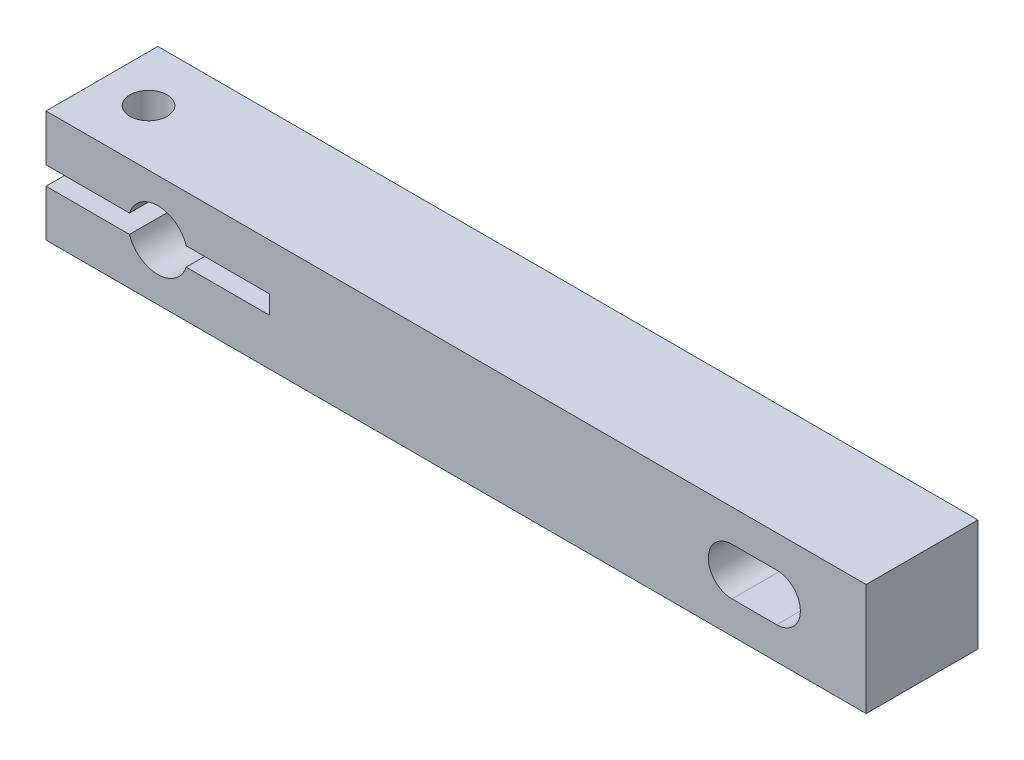
ISO-10303-21;
HEADER;
FILE_DESCRIPTION(('STEP AP214'),'2;1');
FILE_NAME('part.step','',(''),(''),'','','');
FILE_SCHEMA(('AUTOMOTIVE_DESIGN { 1 0 10303 214 1 1 1 1 }'));
ENDSEC;
DATA;
#1=APPLICATION_CONTEXT('core data for automotive mechanical design processes');
#2=APPLICATION_PROTOCOL_DEFINITION('international standard','automotive_design',2000,#1);
#3=PRODUCT_CONTEXT('',#1,'mechanical');
#4=PRODUCT('Part','Part','',(#3));
#5=PRODUCT_RELATED_PRODUCT_CATEGORY('part','',(#4));
#6=PRODUCT_DEFINITION_FORMATION('','',#4);
#7=PRODUCT_DEFINITION_CONTEXT('part definition',#1,'design');
#8=PRODUCT_DEFINITION('design','',#6,#7);
#9=PRODUCT_DEFINITION_SHAPE('','',#8);
#10=(LENGTH_UNIT() NAMED_UNIT(*) SI_UNIT(.MILLI.,.METRE.));
#11=(NAMED_UNIT(*) PLANE_ANGLE_UNIT() SI_UNIT($,.RADIAN.));
#12=(NAMED_UNIT(*) SI_UNIT($,.STERADIAN.) SOLID_ANGLE_UNIT());
#13=UNCERTAINTY_MEASURE_WITH_UNIT(LENGTH_MEASURE(1.E-05),#10,'distance_accuracy_value','');
#14=(GEOMETRIC_REPRESENTATION_CONTEXT(3) GLOBAL_UNCERTAINTY_ASSIGNED_CONTEXT((#13)) GLOBAL_UNIT_ASSIGNED_CONTEXT((#10,
#11,#12)) REPRESENTATION_CONTEXT('',''));
#15=CARTESIAN_POINT('',(0.,0.,0.));
#16=DIRECTION('',(0.,0.,1.));
#17=DIRECTION('',(1.,0.,0.));
#18=AXIS2_PLACEMENT_3D('',#15,#16,#17);
#19=CARTESIAN_POINT('',(55.,-7.5,7.5));
#20=DIRECTION('',(0.,0.,-1.));
#21=DIRECTION('',(-1.,0.,0.));
#22=AXIS2_PLACEMENT_3D('',#19,#20,#21);
#23=PLANE('',#22);
#24=DIRECTION('',(1.,0.,0.));
#25=VECTOR('',#24,1.);
#26=CARTESIAN_POINT('',(37.,-3.175,7.5));
#27=LINE('',#26,#25);
#28=CARTESIAN_POINT('',(37.,-3.175,7.5));
#29=VERTEX_POINT('',#28);
#30=CARTESIAN_POINT('',(43.,-3.175,7.5));
#31=VERTEX_POINT('',#30);
#32=EDGE_CURVE('E173',#29,#31,#27,.T.);
#33=ORIENTED_EDGE('',*,*,#32,.F.);
#34=CARTESIAN_POINT('',(37.,0.,7.5));
#35=DIRECTION('',(0.,0.,1.));
#36=DIRECTION('',(1.,0.,0.));
#37=AXIS2_PLACEMENT_3D('',#34,#35,#36);
#38=CIRCLE('',#37,3.175);
#39=CARTESIAN_POINT('',(37.,3.175,7.5));
#40=VERTEX_POINT('',#39);
#41=EDGE_CURVE('E48',#40,#29,#38,.T.);
#42=ORIENTED_EDGE('',*,*,#41,.F.);
#43=DIRECTION('',(-1.,0.,0.));
#44=VECTOR('',#43,1.);
#45=CARTESIAN_POINT('',(37.,3.175,7.5));
#46=LINE('',#45,#44);
#47=CARTESIAN_POINT('',(43.,3.175,7.5));
#48=VERTEX_POINT('',#47);
#49=EDGE_CURVE('E164',#48,#40,#46,.T.);
#50=ORIENTED_EDGE('',*,*,#49,.F.);
#51=CARTESIAN_POINT('',(43.,0.,7.5));
#52=DIRECTION('',(0.,0.,1.));
#53=DIRECTION('',(1.,0.,0.));
#54=AXIS2_PLACEMENT_3D('',#51,#52,#53);
#55=CIRCLE('',#54,3.175);
#56=EDGE_CURVE('E167',#31,#48,#55,.T.);
#57=ORIENTED_EDGE('',*,*,#56,.F.);
#58=EDGE_LOOP('',(#33,#42,#50,#57));
#59=FACE_BOUND('',#58,.T.);
#60=DIRECTION('',(-1.,0.,0.));
#61=VECTOR('',#60,1.);
#62=CARTESIAN_POINT('',(0.,-1.23990292600951,7.5));
#63=LINE('',#62,#61);
#64=CARTESIAN_POINT('',(-43.8029778771475,-1.23990292600951,7.5));
#65=VERTEX_POINT('',#64);
#66=CARTESIAN_POINT('',(-55.,-1.23990292600951,7.5));
#67=VERTEX_POINT('',#66);
#68=EDGE_CURVE('E196',#65,#67,#63,.T.);
#69=ORIENTED_EDGE('',*,*,#68,.T.);
#70=DIRECTION('',(0.,-1.,0.));
#71=VECTOR('',#70,1.);
#72=CARTESIAN_POINT('',(-55.,-7.5,7.5));
#73=LINE('',#72,#71);
#74=CARTESIAN_POINT('',(-55.,-7.5,7.5));
#75=VERTEX_POINT('',#74);
#76=EDGE_CURVE('E233',#67,#75,#73,.T.);
#77=ORIENTED_EDGE('',*,*,#76,.T.);
#78=DIRECTION('',(-1.,0.,0.));
#79=VECTOR('',#78,1.);
#80=CARTESIAN_POINT('',(55.,-7.5,7.5));
#81=LINE('',#80,#79);
#82=CARTESIAN_POINT('',(55.,-7.5,7.5));
#83=VERTEX_POINT('',#82);
#84=EDGE_CURVE('E11',#83,#75,#81,.T.);
#85=ORIENTED_EDGE('',*,*,#84,.F.);
#86=DIRECTION('',(0.,-1.,0.));
#87=VECTOR('',#86,1.);
#88=CARTESIAN_POINT('',(55.,-7.5,7.5));
#89=LINE('',#88,#87);
#90=CARTESIAN_POINT('',(55.,7.5,7.5));
#91=VERTEX_POINT('',#90);
#92=EDGE_CURVE('E248',#91,#83,#89,.T.);
#93=ORIENTED_EDGE('',*,*,#92,.F.);
#94=DIRECTION('',(-1.,0.,0.));
#95=VECTOR('',#94,1.);
#96=CARTESIAN_POINT('',(55.,7.5,7.5));
#97=LINE('',#96,#95);
#98=CARTESIAN_POINT('',(-55.,7.5,7.5));
#99=VERTEX_POINT('',#98);
#100=EDGE_CURVE('E258',#91,#99,#97,.T.);
#101=ORIENTED_EDGE('',*,*,#100,.T.);
#102=CARTESIAN_POINT('',(-55.,1.23990292600951,7.5));
#103=VERTEX_POINT('',#102);
#104=EDGE_CURVE('E259',#99,#103,#73,.T.);
#105=ORIENTED_EDGE('',*,*,#104,.T.);
#106=DIRECTION('',(-1.,0.,0.));
#107=VECTOR('',#106,1.);
#108=CARTESIAN_POINT('',(0.,1.23990292600951,7.5));
#109=LINE('',#108,#107);
#110=CARTESIAN_POINT('',(-43.8029778771475,1.23990292600951,7.5));
#111=VERTEX_POINT('',#110);
#112=EDGE_CURVE('E227',#111,#103,#109,.T.);
#113=ORIENTED_EDGE('',*,*,#112,.F.);
#114=CARTESIAN_POINT('',(-40.,0.,7.5));
#115=DIRECTION('',(0.,0.,1.));
#116=DIRECTION('',(1.,0.,0.));
#117=AXIS2_PLACEMENT_3D('',#114,#115,#116);
#118=CIRCLE('',#117,4.00000000000001);
#119=CARTESIAN_POINT('',(-36.1970221228525,1.23990292600951,7.5));
#120=VERTEX_POINT('',#119);
#121=EDGE_CURVE('E224',#120,#111,#118,.T.);
#122=ORIENTED_EDGE('',*,*,#121,.F.);
#123=DIRECTION('',(-1.,0.,0.));
#124=VECTOR('',#123,1.);
#125=CARTESIAN_POINT('',(0.,1.23990292600951,7.5));
#126=LINE('',#125,#124);
#127=CARTESIAN_POINT('',(-25.,1.23990292600951,7.5));
#128=VERTEX_POINT('',#127);
#129=EDGE_CURVE('E221',#128,#120,#126,.T.);
#130=ORIENTED_EDGE('',*,*,#129,.F.);
#131=DIRECTION('',(0.,1.,0.));
#132=VECTOR('',#131,1.);
#133=CARTESIAN_POINT('',(-25.,0.,7.5));
#134=LINE('',#133,#132);
#135=CARTESIAN_POINT('',(-25.,-1.23990292600951,7.5));
#136=VERTEX_POINT('',#135);
#137=EDGE_CURVE('E218',#136,#128,#134,.T.);
#138=ORIENTED_EDGE('',*,*,#137,.F.);
#139=DIRECTION('',(-1.,0.,0.));
#140=VECTOR('',#139,1.);
#141=CARTESIAN_POINT('',(0.,-1.23990292600951,7.5));
#142=LINE('',#141,#140);
#143=CARTESIAN_POINT('',(-36.1970221228525,-1.23990292600951,7.5));
#144=VERTEX_POINT('',#143);
#145=EDGE_CURVE('E215',#136,#144,#142,.T.);
#146=ORIENTED_EDGE('',*,*,#145,.T.);
#147=CARTESIAN_POINT('',(-40.,0.,7.5));
#148=DIRECTION('',(0.,0.,1.));
#149=DIRECTION('',(1.,0.,0.));
#150=AXIS2_PLACEMENT_3D('',#147,#148,#149);
#151=CIRCLE('',#150,4.00000000000001);
#152=EDGE_CURVE('E191',#65,#144,#151,.T.);
#153=ORIENTED_EDGE('',*,*,#152,.F.);
#154=EDGE_LOOP('',(#69,#77,#85,#93,#101,#105,#113,#122,#130,#138,#146,#153));
#155=FACE_BOUND('',#154,.T.);
#156=ADVANCED_FACE('F33',(#59,#155),#23,.F.);
#157=CARTESIAN_POINT('',(55.,-7.5,-7.5));
#158=DIRECTION('',(0.,0.,1.));
#159=DIRECTION('',(0.,-1.,0.));
#160=AXIS2_PLACEMENT_3D('',#157,#158,#159);
#161=PLANE('',#160);
#162=DIRECTION('',(-1.,0.,0.));
#163=VECTOR('',#162,1.);
#164=CARTESIAN_POINT('',(37.,3.175,-7.5));
#165=LINE('',#164,#163);
#166=CARTESIAN_POINT('',(43.,3.175,-7.5));
#167=VERTEX_POINT('',#166);
#168=CARTESIAN_POINT('',(37.,3.175,-7.5));
#169=VERTEX_POINT('',#168);
#170=EDGE_CURVE('E154',#167,#169,#165,.T.);
#171=ORIENTED_EDGE('',*,*,#170,.T.);
#172=CARTESIAN_POINT('',(37.,0.,-7.5));
#173=DIRECTION('',(0.,0.,1.));
#174=DIRECTION('',(1.,0.,0.));
#175=AXIS2_PLACEMENT_3D('',#172,#173,#174);
#176=CIRCLE('',#175,3.175);
#177=CARTESIAN_POINT('',(37.,-3.175,-7.5));
#178=VERTEX_POINT('',#177);
#179=EDGE_CURVE('E148',#169,#178,#176,.T.);
#180=ORIENTED_EDGE('',*,*,#179,.T.);
#181=DIRECTION('',(1.,0.,0.));
#182=VECTOR('',#181,1.);
#183=CARTESIAN_POINT('',(37.,-3.175,-7.5));
#184=LINE('',#183,#182);
#185=CARTESIAN_POINT('',(43.,-3.175,-7.5));
#186=VERTEX_POINT('',#185);
#187=EDGE_CURVE('E157',#178,#186,#184,.T.);
#188=ORIENTED_EDGE('',*,*,#187,.T.);
#189=CARTESIAN_POINT('',(43.,0.,-7.5));
#190=DIRECTION('',(0.,0.,1.));
#191=DIRECTION('',(1.,0.,0.));
#192=AXIS2_PLACEMENT_3D('',#189,#190,#191);
#193=CIRCLE('',#192,3.175);
#194=EDGE_CURVE('E56',#186,#167,#193,.T.);
#195=ORIENTED_EDGE('',*,*,#194,.T.);
#196=EDGE_LOOP('',(#171,#180,#188,#195));
#197=FACE_BOUND('',#196,.T.);
#198=DIRECTION('',(-1.,0.,0.));
#199=VECTOR('',#198,1.);
#200=CARTESIAN_POINT('',(0.,-1.23990292600951,-7.5));
#201=LINE('',#200,#199);
#202=CARTESIAN_POINT('',(-43.8029778771475,-1.23990292600951,-7.5));
#203=VERTEX_POINT('',#202);
#204=CARTESIAN_POINT('',(-55.,-1.23990292600951,-7.5));
#205=VERTEX_POINT('',#204);
#206=EDGE_CURVE('E210',#203,#205,#201,.T.);
#207=ORIENTED_EDGE('',*,*,#206,.F.);
#208=CARTESIAN_POINT('',(-40.,0.,-7.5));
#209=DIRECTION('',(0.,0.,1.));
#210=DIRECTION('',(1.,0.,0.));
#211=AXIS2_PLACEMENT_3D('',#208,#209,#210);
#212=CIRCLE('',#211,4.00000000000001);
#213=CARTESIAN_POINT('',(-36.1970221228525,-1.23990292600951,-7.5));
#214=VERTEX_POINT('',#213);
#215=EDGE_CURVE('E192',#203,#214,#212,.T.);
#216=ORIENTED_EDGE('',*,*,#215,.T.);
#217=DIRECTION('',(-1.,0.,0.));
#218=VECTOR('',#217,1.);
#219=CARTESIAN_POINT('',(0.,-1.23990292600951,-7.5));
#220=LINE('',#219,#218);
#221=CARTESIAN_POINT('',(-25.,-1.23990292600951,-7.5));
#222=VERTEX_POINT('',#221);
#223=EDGE_CURVE('E195',#222,#214,#220,.T.);
#224=ORIENTED_EDGE('',*,*,#223,.F.);
#225=DIRECTION('',(0.,1.,0.));
#226=VECTOR('',#225,1.);
#227=CARTESIAN_POINT('',(-25.,0.,-7.5));
#228=LINE('',#227,#226);
#229=CARTESIAN_POINT('',(-25.,1.23990292600951,-7.5));
#230=VERTEX_POINT('',#229);
#231=EDGE_CURVE('E198',#222,#230,#228,.T.);
#232=ORIENTED_EDGE('',*,*,#231,.T.);
#233=DIRECTION('',(-1.,0.,0.));
#234=VECTOR('',#233,1.);
#235=CARTESIAN_POINT('',(0.,1.23990292600951,-7.5));
#236=LINE('',#235,#234);
#237=CARTESIAN_POINT('',(-36.1970221228525,1.23990292600951,-7.5));
#238=VERTEX_POINT('',#237);
#239=EDGE_CURVE('E201',#230,#238,#236,.T.);
#240=ORIENTED_EDGE('',*,*,#239,.T.);
#241=CARTESIAN_POINT('',(-40.,0.,-7.5));
#242=DIRECTION('',(0.,0.,1.));
#243=DIRECTION('',(1.,0.,0.));
#244=AXIS2_PLACEMENT_3D('',#241,#242,#243);
#245=CIRCLE('',#244,4.00000000000001);
#246=CARTESIAN_POINT('',(-43.8029778771475,1.23990292600951,-7.5));
#247=VERTEX_POINT('',#246);
#248=EDGE_CURVE('E204',#238,#247,#245,.T.);
#249=ORIENTED_EDGE('',*,*,#248,.T.);
#250=DIRECTION('',(-1.,0.,0.));
#251=VECTOR('',#250,1.);
#252=CARTESIAN_POINT('',(0.,1.23990292600951,-7.5));
#253=LINE('',#252,#251);
#254=CARTESIAN_POINT('',(-55.,1.23990292600951,-7.5));
#255=VERTEX_POINT('',#254);
#256=EDGE_CURVE('E207',#247,#255,#253,.T.);
#257=ORIENTED_EDGE('',*,*,#256,.T.);
#258=DIRECTION('',(0.,1.,0.));
#259=VECTOR('',#258,1.);
#260=CARTESIAN_POINT('',(-55.,-7.5,-7.5));
#261=LINE('',#260,#259);
#262=CARTESIAN_POINT('',(-55.,7.5,-7.5));
#263=VERTEX_POINT('',#262);
#264=EDGE_CURVE('E264',#255,#263,#261,.T.);
#265=ORIENTED_EDGE('',*,*,#264,.T.);
#266=DIRECTION('',(-1.,0.,0.));
#267=VECTOR('',#266,1.);
#268=CARTESIAN_POINT('',(55.,7.5,-7.5));
#269=LINE('',#268,#267);
#270=CARTESIAN_POINT('',(55.,7.5,-7.5));
#271=VERTEX_POINT('',#270);
#272=EDGE_CURVE('E271',#271,#263,#269,.T.);
#273=ORIENTED_EDGE('',*,*,#272,.F.);
#274=DIRECTION('',(0.,1.,0.));
#275=VECTOR('',#274,1.);
#276=CARTESIAN_POINT('',(55.,-7.5,-7.5));
#277=LINE('',#276,#275);
#278=CARTESIAN_POINT('',(55.,-7.5,-7.5));
#279=VERTEX_POINT('',#278);
#280=EDGE_CURVE('E254',#279,#271,#277,.T.);
#281=ORIENTED_EDGE('',*,*,#280,.F.);
#282=DIRECTION('',(-1.,0.,0.));
#283=VECTOR('',#282,1.);
#284=CARTESIAN_POINT('',(55.,-7.5,-7.5));
#285=LINE('',#284,#283);
#286=CARTESIAN_POINT('',(-55.,-7.5,-7.5));
#287=VERTEX_POINT('',#286);
#288=EDGE_CURVE('E41',#279,#287,#285,.T.);
#289=ORIENTED_EDGE('',*,*,#288,.T.);
#290=EDGE_CURVE('E265',#287,#205,#261,.T.);
#291=ORIENTED_EDGE('',*,*,#290,.T.);
#292=EDGE_LOOP('',(#207,#216,#224,#232,#240,#249,#257,#265,#273,#281,#289,#291));
#293=FACE_BOUND('',#292,.T.);
#294=ADVANCED_FACE('F161',(#197,#293),#161,.F.);
#295=CARTESIAN_POINT('',(-55.,0.,0.));
#296=DIRECTION('',(1.,0.,0.));
#297=DIRECTION('',(0.,0.,-1.));
#298=AXIS2_PLACEMENT_3D('',#295,#296,#297);
#299=PLANE('',#298);
#300=DIRECTION('',(0.,0.,1.));
#301=VECTOR('',#300,1.);
#302=CARTESIAN_POINT('',(-55.,-1.23990292600951,-7.5));
#303=LINE('',#302,#301);
#304=EDGE_CURVE('E234',#205,#67,#303,.T.);
#305=ORIENTED_EDGE('',*,*,#304,.F.);
#306=ORIENTED_EDGE('',*,*,#290,.F.);
#307=DIRECTION('',(0.,0.,-1.));
#308=VECTOR('',#307,1.);
#309=CARTESIAN_POINT('',(-55.,-7.5,-7.5));
#310=LINE('',#309,#308);
#311=EDGE_CURVE('E262',#75,#287,#310,.T.);
#312=ORIENTED_EDGE('',*,*,#311,.F.);
#313=ORIENTED_EDGE('',*,*,#76,.F.);
#314=EDGE_LOOP('',(#305,#306,#312,#313));
#315=FACE_BOUND('',#314,.T.);
#316=ADVANCED_FACE('F284',(#315),#299,.F.);
#317=CARTESIAN_POINT('',(55.,-7.5,-7.5));
#318=DIRECTION('',(0.,1.,0.));
#319=DIRECTION('',(0.,0.,1.));
#320=AXIS2_PLACEMENT_3D('',#317,#318,#319);
#321=PLANE('',#320);
#322=CARTESIAN_POINT('',(-48.75,-7.5,0.));
#323=DIRECTION('',(0.,1.,0.));
#324=DIRECTION('',(0.,0.,1.));
#325=AXIS2_PLACEMENT_3D('',#322,#323,#324);
#326=CIRCLE('',#325,2.5);
#327=CARTESIAN_POINT('',(-48.75,-7.5,2.5));
#328=VERTEX_POINT('',#327);
#329=EDGE_CURVE('E183',#328,#328,#326,.T.);
#330=ORIENTED_EDGE('',*,*,#329,.T.);
#331=EDGE_LOOP('',(#330));
#332=FACE_BOUND('',#331,.T.);
#333=ORIENTED_EDGE('',*,*,#311,.T.);
#334=ORIENTED_EDGE('',*,*,#288,.F.);
#335=DIRECTION('',(0.,0.,-1.));
#336=VECTOR('',#335,1.);
#337=CARTESIAN_POINT('',(55.,-7.5,-7.5));
#338=LINE('',#337,#336);
#339=EDGE_CURVE('E251',#83,#279,#338,.T.);
#340=ORIENTED_EDGE('',*,*,#339,.F.);
#341=ORIENTED_EDGE('',*,*,#84,.T.);
#342=EDGE_LOOP('',(#333,#334,#340,#341));
#343=FACE_BOUND('',#342,.T.);
#344=ADVANCED_FACE('F328',(#332,#343),#321,.F.);
#345=CARTESIAN_POINT('',(55.,7.5,-7.5));
#346=DIRECTION('',(0.,-1.,0.));
#347=DIRECTION('',(0.,0.,-1.));
#348=AXIS2_PLACEMENT_3D('',#345,#346,#347);
#349=PLANE('',#348);
#350=CARTESIAN_POINT('',(-48.75,7.5,0.));
#351=DIRECTION('',(0.,1.,0.));
#352=DIRECTION('',(0.,0.,1.));
#353=AXIS2_PLACEMENT_3D('',#350,#351,#352);
#354=CIRCLE('',#353,2.5);
#355=CARTESIAN_POINT('',(-48.75,7.5,2.5));
#356=VERTEX_POINT('',#355);
#357=EDGE_CURVE('E179',#356,#356,#354,.T.);
#358=ORIENTED_EDGE('',*,*,#357,.F.);
#359=EDGE_LOOP('',(#358));
#360=FACE_BOUND('',#359,.T.);
#361=DIRECTION('',(0.,0.,1.));
#362=VECTOR('',#361,1.);
#363=CARTESIAN_POINT('',(-55.,7.5,-7.5));
#364=LINE('',#363,#362);
#365=EDGE_CURVE('E252',#263,#99,#364,.T.);
#366=ORIENTED_EDGE('',*,*,#365,.T.);
#367=ORIENTED_EDGE('',*,*,#100,.F.);
#368=DIRECTION('',(0.,0.,1.));
#369=VECTOR('',#368,1.);
#370=CARTESIAN_POINT('',(55.,7.5,-7.5));
#371=LINE('',#370,#369);
#372=EDGE_CURVE('E256',#271,#91,#371,.T.);
#373=ORIENTED_EDGE('',*,*,#372,.F.);
#374=ORIENTED_EDGE('',*,*,#272,.T.);
#375=EDGE_LOOP('',(#366,#367,#373,#374));
#376=FACE_BOUND('',#375,.T.);
#377=ADVANCED_FACE('F325',(#360,#376),#349,.F.);
#378=CARTESIAN_POINT('',(55.,0.,0.));
#379=DIRECTION('',(1.,0.,0.));
#380=DIRECTION('',(0.,0.,-1.));
#381=AXIS2_PLACEMENT_3D('',#378,#379,#380);
#382=PLANE('',#381);
#383=ORIENTED_EDGE('',*,*,#92,.T.);
#384=ORIENTED_EDGE('',*,*,#339,.T.);
#385=ORIENTED_EDGE('',*,*,#280,.T.);
#386=ORIENTED_EDGE('',*,*,#372,.T.);
#387=EDGE_LOOP('',(#383,#384,#385,#386));
#388=FACE_BOUND('',#387,.T.);
#389=ADVANCED_FACE('F327',(#388),#382,.T.);
#390=ORIENTED_EDGE('',*,*,#264,.F.);
#391=DIRECTION('',(0.,0.,1.));
#392=VECTOR('',#391,1.);
#393=CARTESIAN_POINT('',(-55.,1.23990292600951,-7.5));
#394=LINE('',#393,#392);
#395=EDGE_CURVE('E236',#255,#103,#394,.T.);
#396=ORIENTED_EDGE('',*,*,#395,.T.);
#397=ORIENTED_EDGE('',*,*,#104,.F.);
#398=ORIENTED_EDGE('',*,*,#365,.F.);
#399=EDGE_LOOP('',(#390,#396,#397,#398));
#400=FACE_BOUND('',#399,.T.);
#401=ADVANCED_FACE('F319',(#400),#299,.F.);
#402=CARTESIAN_POINT('',(-40.,0.,-7.5));
#403=DIRECTION('',(0.,0.,1.));
#404=DIRECTION('',(1.,0.,0.));
#405=AXIS2_PLACEMENT_3D('',#402,#403,#404);
#406=CYLINDRICAL_SURFACE('',#405,4.00000000000001);
#407=ORIENTED_EDGE('',*,*,#152,.T.);
#408=DIRECTION('',(0.,0.,1.));
#409=VECTOR('',#408,1.);
#410=CARTESIAN_POINT('',(-36.1970221228525,-1.23990292600951,-7.5));
#411=LINE('',#410,#409);
#412=EDGE_CURVE('E212',#214,#144,#411,.T.);
#413=ORIENTED_EDGE('',*,*,#412,.F.);
#414=ORIENTED_EDGE('',*,*,#215,.F.);
#415=DIRECTION('',(0.,0.,1.));
#416=VECTOR('',#415,1.);
#417=CARTESIAN_POINT('',(-43.8029778771475,-1.23990292600951,-7.5));
#418=LINE('',#417,#416);
#419=EDGE_CURVE('E231',#203,#65,#418,.T.);
#420=ORIENTED_EDGE('',*,*,#419,.T.);
#421=EDGE_LOOP('',(#407,#413,#414,#420));
#422=FACE_BOUND('',#421,.T.);
#423=ADVANCED_FACE('F296',(#422),#406,.F.);
#424=CARTESIAN_POINT('',(0.,-1.23990292600951,-7.5));
#425=DIRECTION('',(0.,1.,0.));
#426=DIRECTION('',(0.,0.,1.));
#427=AXIS2_PLACEMENT_3D('',#424,#425,#426);
#428=PLANE('',#427);
#429=CARTESIAN_POINT('',(-48.75,-1.23990292600951,0.));
#430=DIRECTION('',(0.,1.,0.));
#431=DIRECTION('',(0.,0.,1.));
#432=AXIS2_PLACEMENT_3D('',#429,#430,#431);
#433=CIRCLE('',#432,2.5);
#434=CARTESIAN_POINT('',(-48.75,-1.23990292600951,2.5));
#435=VERTEX_POINT('',#434);
#436=EDGE_CURVE('E188',#435,#435,#433,.T.);
#437=ORIENTED_EDGE('',*,*,#436,.F.);
#438=EDGE_LOOP('',(#437));
#439=FACE_BOUND('',#438,.T.);
#440=ORIENTED_EDGE('',*,*,#68,.F.);
#441=ORIENTED_EDGE('',*,*,#419,.F.);
#442=ORIENTED_EDGE('',*,*,#206,.T.);
#443=ORIENTED_EDGE('',*,*,#304,.T.);
#444=EDGE_LOOP('',(#440,#441,#442,#443));
#445=FACE_BOUND('',#444,.T.);
#446=ADVANCED_FACE('F288',(#439,#445),#428,.T.);
#447=CARTESIAN_POINT('',(0.,1.23990292600951,-7.5));
#448=DIRECTION('',(0.,1.,0.));
#449=DIRECTION('',(0.,0.,1.));
#450=AXIS2_PLACEMENT_3D('',#447,#448,#449);
#451=PLANE('',#450);
#452=CARTESIAN_POINT('',(-48.75,1.23990292600951,0.));
#453=DIRECTION('',(0.,1.,0.));
#454=DIRECTION('',(0.,0.,1.));
#455=AXIS2_PLACEMENT_3D('',#452,#453,#454);
#456=CIRCLE('',#455,2.5);
#457=CARTESIAN_POINT('',(-48.75,1.23990292600951,2.5));
#458=VERTEX_POINT('',#457);
#459=EDGE_CURVE('E36',#458,#458,#456,.T.);
#460=ORIENTED_EDGE('',*,*,#459,.T.);
#461=EDGE_LOOP('',(#460));
#462=FACE_BOUND('',#461,.T.);
#463=ORIENTED_EDGE('',*,*,#112,.T.);
#464=ORIENTED_EDGE('',*,*,#395,.F.);
#465=ORIENTED_EDGE('',*,*,#256,.F.);
#466=DIRECTION('',(0.,0.,1.));
#467=VECTOR('',#466,1.);
#468=CARTESIAN_POINT('',(-43.8029778771475,1.23990292600951,-7.5));
#469=LINE('',#468,#467);
#470=EDGE_CURVE('E239',#247,#111,#469,.T.);
#471=ORIENTED_EDGE('',*,*,#470,.T.);
#472=EDGE_LOOP('',(#463,#464,#465,#471));
#473=FACE_BOUND('',#472,.T.);
#474=ADVANCED_FACE('F316',(#462,#473),#451,.F.);
#475=CARTESIAN_POINT('',(-40.,0.,-7.5));
#476=DIRECTION('',(0.,0.,1.));
#477=DIRECTION('',(1.,0.,0.));
#478=AXIS2_PLACEMENT_3D('',#475,#476,#477);
#479=CYLINDRICAL_SURFACE('',#478,4.00000000000001);
#480=ORIENTED_EDGE('',*,*,#121,.T.);
#481=ORIENTED_EDGE('',*,*,#470,.F.);
#482=ORIENTED_EDGE('',*,*,#248,.F.);
#483=DIRECTION('',(0.,0.,1.));
#484=VECTOR('',#483,1.);
#485=CARTESIAN_POINT('',(-36.1970221228525,1.23990292600951,-7.5));
#486=LINE('',#485,#484);
#487=EDGE_CURVE('E241',#238,#120,#486,.T.);
#488=ORIENTED_EDGE('',*,*,#487,.T.);
#489=EDGE_LOOP('',(#480,#481,#482,#488));
#490=FACE_BOUND('',#489,.T.);
#491=ADVANCED_FACE('F312',(#490),#479,.F.);
#492=CARTESIAN_POINT('',(0.,1.23990292600951,-7.5));
#493=DIRECTION('',(0.,1.,0.));
#494=DIRECTION('',(0.,0.,1.));
#495=AXIS2_PLACEMENT_3D('',#492,#493,#494);
#496=PLANE('',#495);
#497=ORIENTED_EDGE('',*,*,#129,.T.);
#498=ORIENTED_EDGE('',*,*,#487,.F.);
#499=ORIENTED_EDGE('',*,*,#239,.F.);
#500=DIRECTION('',(0.,0.,1.));
#501=VECTOR('',#500,1.);
#502=CARTESIAN_POINT('',(-25.,1.23990292600951,-7.5));
#503=LINE('',#502,#501);
#504=EDGE_CURVE('E243',#230,#128,#503,.T.);
#505=ORIENTED_EDGE('',*,*,#504,.T.);
#506=EDGE_LOOP('',(#497,#498,#499,#505));
#507=FACE_BOUND('',#506,.T.);
#508=ADVANCED_FACE('F307',(#507),#496,.F.);
#509=CARTESIAN_POINT('',(-25.,0.,-7.5));
#510=DIRECTION('',(1.,0.,0.));
#511=DIRECTION('',(0.,0.,-1.));
#512=AXIS2_PLACEMENT_3D('',#509,#510,#511);
#513=PLANE('',#512);
#514=ORIENTED_EDGE('',*,*,#137,.T.);
#515=ORIENTED_EDGE('',*,*,#504,.F.);
#516=ORIENTED_EDGE('',*,*,#231,.F.);
#517=DIRECTION('',(0.,0.,1.));
#518=VECTOR('',#517,1.);
#519=CARTESIAN_POINT('',(-25.,-1.23990292600951,-7.5));
#520=LINE('',#519,#518);
#521=EDGE_CURVE('E245',#222,#136,#520,.T.);
#522=ORIENTED_EDGE('',*,*,#521,.T.);
#523=EDGE_LOOP('',(#514,#515,#516,#522));
#524=FACE_BOUND('',#523,.T.);
#525=ADVANCED_FACE('F303',(#524),#513,.F.);
#526=CARTESIAN_POINT('',(0.,-1.23990292600951,-7.5));
#527=DIRECTION('',(0.,1.,0.));
#528=DIRECTION('',(0.,0.,1.));
#529=AXIS2_PLACEMENT_3D('',#526,#527,#528);
#530=PLANE('',#529);
#531=ORIENTED_EDGE('',*,*,#145,.F.);
#532=ORIENTED_EDGE('',*,*,#521,.F.);
#533=ORIENTED_EDGE('',*,*,#223,.T.);
#534=ORIENTED_EDGE('',*,*,#412,.T.);
#535=EDGE_LOOP('',(#531,#532,#533,#534));
#536=FACE_BOUND('',#535,.T.);
#537=ADVANCED_FACE('F301',(#536),#530,.T.);
#538=CARTESIAN_POINT('',(-48.75,-7.5,0.));
#539=DIRECTION('',(0.,1.,0.));
#540=DIRECTION('',(0.,0.,1.));
#541=AXIS2_PLACEMENT_3D('',#538,#539,#540);
#542=CYLINDRICAL_SURFACE('',#541,2.5);
#543=CARTESIAN_POINT('',(-48.75,7.5,2.5));
#544=CARTESIAN_POINT('',(-48.75,7.43479065547927,2.5));
#545=CARTESIAN_POINT('',(-48.75,7.36958131095853,2.5));
#546=CARTESIAN_POINT('',(-48.75,7.23916262191706,2.5));
#547=CARTESIAN_POINT('',(-48.75,7.17395327739633,2.5));
#548=CARTESIAN_POINT('',(-48.75,7.04353458835486,2.5));
#549=CARTESIAN_POINT('',(-48.75,6.97832524383413,2.5));
#550=CARTESIAN_POINT('',(-48.75,6.84790655479266,2.5));
#551=CARTESIAN_POINT('',(-48.75,6.78269721027192,2.5));
#552=CARTESIAN_POINT('',(-48.75,6.65227852123046,2.5));
#553=CARTESIAN_POINT('',(-48.75,6.58706917670972,2.5));
#554=CARTESIAN_POINT('',(-48.75,6.45665048766825,2.5));
#555=CARTESIAN_POINT('',(-48.75,6.39144114314752,2.5));
#556=CARTESIAN_POINT('',(-48.75,6.26102245410605,2.5));
#557=CARTESIAN_POINT('',(-48.75,6.19581310958531,2.5));
#558=CARTESIAN_POINT('',(-48.75,6.06539442054385,2.5));
#559=CARTESIAN_POINT('',(-48.75,6.00018507602311,2.5));
#560=CARTESIAN_POINT('',(-48.75,5.86976638698165,2.5));
#561=CARTESIAN_POINT('',(-48.75,5.80455704246091,2.5));
#562=CARTESIAN_POINT('',(-48.75,5.67413835341944,2.5));
#563=CARTESIAN_POINT('',(-48.75,5.60892900889871,2.5));
#564=CARTESIAN_POINT('',(-48.75,5.47851031985724,2.5));
#565=CARTESIAN_POINT('',(-48.75,5.4133009753365,2.5));
#566=CARTESIAN_POINT('',(-48.75,5.28288228629504,2.5));
#567=CARTESIAN_POINT('',(-48.75,5.2176729417743,2.5));
#568=CARTESIAN_POINT('',(-48.75,5.08725425273283,2.5));
#569=CARTESIAN_POINT('',(-48.75,5.0220449082121,2.5));
#570=CARTESIAN_POINT('',(-48.75,4.89162621917063,2.5));
#571=CARTESIAN_POINT('',(-48.75,4.82641687464989,2.5));
#572=CARTESIAN_POINT('',(-48.75,4.69599818560843,2.5));
#573=CARTESIAN_POINT('',(-48.75,4.63078884108769,2.5));
#574=CARTESIAN_POINT('',(-48.75,4.50037015204622,2.5));
#575=CARTESIAN_POINT('',(-48.75,4.43516080752549,2.5));
#576=CARTESIAN_POINT('',(-48.75,4.30474211848402,2.5));
#577=CARTESIAN_POINT('',(-48.75,4.23953277396329,2.5));
#578=CARTESIAN_POINT('',(-48.75,4.10911408492182,2.5));
#579=CARTESIAN_POINT('',(-48.75,4.04390474040108,2.5));
#580=CARTESIAN_POINT('',(-48.75,3.91348605135962,2.5));
#581=CARTESIAN_POINT('',(-48.75,3.84827670683888,2.5));
#582=CARTESIAN_POINT('',(-48.75,3.71785801779741,2.5));
#583=CARTESIAN_POINT('',(-48.75,3.65264867327668,2.5));
#584=CARTESIAN_POINT('',(-48.75,3.52222998423521,2.5));
#585=CARTESIAN_POINT('',(-48.75,3.45702063971448,2.5));
#586=CARTESIAN_POINT('',(-48.75,3.32660195067301,2.5));
#587=CARTESIAN_POINT('',(-48.75,3.26139260615227,2.5));
#588=CARTESIAN_POINT('',(-48.75,3.1309739171108,2.5));
#589=CARTESIAN_POINT('',(-48.75,3.06576457259007,2.5));
#590=CARTESIAN_POINT('',(-48.75,2.9353458835486,2.5));
#591=CARTESIAN_POINT('',(-48.75,2.87013653902787,2.5));
#592=CARTESIAN_POINT('',(-48.75,2.7397178499864,2.5));
#593=CARTESIAN_POINT('',(-48.75,2.67450850546566,2.5));
#594=CARTESIAN_POINT('',(-48.75,2.5440898164242,2.5));
#595=CARTESIAN_POINT('',(-48.75,2.47888047190346,2.5));
#596=CARTESIAN_POINT('',(-48.75,2.34846178286199,2.5));
#597=CARTESIAN_POINT('',(-48.75,2.28325243834126,2.5));
#598=CARTESIAN_POINT('',(-48.75,2.15283374929979,2.5));
#599=CARTESIAN_POINT('',(-48.75,2.08762440477906,2.5));
#600=CARTESIAN_POINT('',(-48.75,1.95720571573759,2.5));
#601=CARTESIAN_POINT('',(-48.75,1.89199637121685,2.5));
#602=CARTESIAN_POINT('',(-48.75,1.76157768217538,2.5));
#603=CARTESIAN_POINT('',(-48.75,1.69636833765465,2.5));
#604=CARTESIAN_POINT('',(-48.75,1.56594964861318,2.5));
#605=CARTESIAN_POINT('',(-48.75,1.50074030409245,2.5));
#606=CARTESIAN_POINT('',(-48.75,1.37032161505098,2.5));
#607=CARTESIAN_POINT('',(-48.75,1.30511227053024,2.5));
#608=CARTESIAN_POINT('',(-48.75,1.23990292600951,2.5));
#609=B_SPLINE_CURVE_WITH_KNOTS('',3,(#543,#544,#545,#546,#547,#548,#549,#550,#551,#552,#553,
#554,#555,#556,#557,#558,#559,#560,#561,#562,#563,#564,#565,#566,#567,#568,#569,#570,#571,#572,
#573,#574,#575,#576,#577,#578,#579,#580,#581,#582,#583,#584,#585,#586,#587,#588,#589,#590,#591,
#592,#593,#594,#595,#596,#597,#598,#599,#600,#601,#602,#603,#604,#605,#606,#607,#608),
.UNSPECIFIED.,.F.,.F.,(4,2,2,2,2,2,2,2,2,2,2,2,2,2,2,2,2,2,2,2,2,2,2,2,2,2,2,2,2,2,2,2,4),(0.,
0.195628033562203,0.391256067124406,0.586884100686608,0.782512134248811,0.978140167811014,
1.17376820137322,1.36939623493542,1.56502426849762,1.76065230205982,1.95628033562203,
2.15190836918423,2.34753640274643,2.54316443630864,2.73879246987084,2.93442050343304,
3.13004853699525,3.32567657055745,3.52130460411965,3.71693263768185,3.91256067124406,
4.10818870480626,4.30381673836846,4.49944477193066,4.69507280549287,4.89070083905507,
5.08632887261727,5.28195690617948,5.47758493974168,5.67321297330388,5.86884100686608,
6.06446904042829,6.26009707399049),.UNSPECIFIED.);
#610=EDGE_CURVE('BSEAM363',#356,#458,#609,.T.);
#611=ORIENTED_EDGE('',*,*,#357,.T.);
#612=ORIENTED_EDGE('',*,*,#459,.F.);
#613=ORIENTED_EDGE('',*,*,#610,.T.);
#614=ORIENTED_EDGE('',*,*,#610,.F.);
#615=EDGE_LOOP('',(#611,#613,#612,#614));
#616=FACE_BOUND('',#615,.T.);
#617=ADVANCED_FACE('F363',(#616),#542,.F.);
#618=CARTESIAN_POINT('',(-48.75,-1.23990292600951,2.5));
#619=CARTESIAN_POINT('',(-48.75,-1.30511227053024,2.5));
#620=CARTESIAN_POINT('',(-48.75,-1.37032161505098,2.5));
#621=CARTESIAN_POINT('',(-48.75,-1.50074030409245,2.5));
#622=CARTESIAN_POINT('',(-48.75,-1.56594964861318,2.5));
#623=CARTESIAN_POINT('',(-48.75,-1.69636833765465,2.5));
#624=CARTESIAN_POINT('',(-48.75,-1.76157768217538,2.5));
#625=CARTESIAN_POINT('',(-48.75,-1.89199637121685,2.5));
#626=CARTESIAN_POINT('',(-48.75,-1.95720571573759,2.5));
#627=CARTESIAN_POINT('',(-48.75,-2.08762440477906,2.5));
#628=CARTESIAN_POINT('',(-48.75,-2.15283374929979,2.5));
#629=CARTESIAN_POINT('',(-48.75,-2.28325243834126,2.5));
#630=CARTESIAN_POINT('',(-48.75,-2.34846178286199,2.5));
#631=CARTESIAN_POINT('',(-48.75,-2.47888047190346,2.5));
#632=CARTESIAN_POINT('',(-48.75,-2.5440898164242,2.5));
#633=CARTESIAN_POINT('',(-48.75,-2.67450850546566,2.5));
#634=CARTESIAN_POINT('',(-48.75,-2.7397178499864,2.5));
#635=CARTESIAN_POINT('',(-48.75,-2.87013653902787,2.5));
#636=CARTESIAN_POINT('',(-48.75,-2.9353458835486,2.5));
#637=CARTESIAN_POINT('',(-48.75,-3.06576457259007,2.5));
#638=CARTESIAN_POINT('',(-48.75,-3.1309739171108,2.5));
#639=CARTESIAN_POINT('',(-48.75,-3.26139260615227,2.5));
#640=CARTESIAN_POINT('',(-48.75,-3.32660195067301,2.5));
#641=CARTESIAN_POINT('',(-48.75,-3.45702063971448,2.5));
#642=CARTESIAN_POINT('',(-48.75,-3.52222998423521,2.5));
#643=CARTESIAN_POINT('',(-48.75,-3.65264867327668,2.5));
#644=CARTESIAN_POINT('',(-48.75,-3.71785801779741,2.5));
#645=CARTESIAN_POINT('',(-48.75,-3.84827670683888,2.5));
#646=CARTESIAN_POINT('',(-48.75,-3.91348605135962,2.5));
#647=CARTESIAN_POINT('',(-48.75,-4.04390474040108,2.5));
#648=CARTESIAN_POINT('',(-48.75,-4.10911408492182,2.5));
#649=CARTESIAN_POINT('',(-48.75,-4.23953277396329,2.5));
#650=CARTESIAN_POINT('',(-48.75,-4.30474211848402,2.5));
#651=CARTESIAN_POINT('',(-48.75,-4.43516080752549,2.5));
#652=CARTESIAN_POINT('',(-48.75,-4.50037015204622,2.5));
#653=CARTESIAN_POINT('',(-48.75,-4.63078884108769,2.5));
#654=CARTESIAN_POINT('',(-48.75,-4.69599818560843,2.5));
#655=CARTESIAN_POINT('',(-48.75,-4.82641687464989,2.5));
#656=CARTESIAN_POINT('',(-48.75,-4.89162621917063,2.5));
#657=CARTESIAN_POINT('',(-48.75,-5.0220449082121,2.5));
#658=CARTESIAN_POINT('',(-48.75,-5.08725425273283,2.5));
#659=CARTESIAN_POINT('',(-48.75,-5.2176729417743,2.5));
#660=CARTESIAN_POINT('',(-48.75,-5.28288228629504,2.5));
#661=CARTESIAN_POINT('',(-48.75,-5.4133009753365,2.5));
#662=CARTESIAN_POINT('',(-48.75,-5.47851031985724,2.5));
#663=CARTESIAN_POINT('',(-48.75,-5.60892900889871,2.5));
#664=CARTESIAN_POINT('',(-48.75,-5.67413835341944,2.5));
#665=CARTESIAN_POINT('',(-48.75,-5.80455704246091,2.5));
#666=CARTESIAN_POINT('',(-48.75,-5.86976638698164,2.5));
#667=CARTESIAN_POINT('',(-48.75,-6.00018507602311,2.5));
#668=CARTESIAN_POINT('',(-48.75,-6.06539442054385,2.5));
#669=CARTESIAN_POINT('',(-48.75,-6.19581310958532,2.5));
#670=CARTESIAN_POINT('',(-48.75,-6.26102245410605,2.5));
#671=CARTESIAN_POINT('',(-48.75,-6.39144114314752,2.5));
#672=CARTESIAN_POINT('',(-48.75,-6.45665048766825,2.5));
#673=CARTESIAN_POINT('',(-48.75,-6.58706917670972,2.5));
#674=CARTESIAN_POINT('',(-48.75,-6.65227852123046,2.5));
#675=CARTESIAN_POINT('',(-48.75,-6.78269721027192,2.5));
#676=CARTESIAN_POINT('',(-48.75,-6.84790655479266,2.5));
#677=CARTESIAN_POINT('',(-48.75,-6.97832524383413,2.5));
#678=CARTESIAN_POINT('',(-48.75,-7.04353458835486,2.5));
#679=CARTESIAN_POINT('',(-48.75,-7.17395327739633,2.5));
#680=CARTESIAN_POINT('',(-48.75,-7.23916262191706,2.5));
#681=CARTESIAN_POINT('',(-48.75,-7.36958131095853,2.5));
#682=CARTESIAN_POINT('',(-48.75,-7.43479065547927,2.5));
#683=CARTESIAN_POINT('',(-48.75,-7.5,2.5));
#684=B_SPLINE_CURVE_WITH_KNOTS('',3,(#618,#619,#620,#621,#622,#623,#624,#625,#626,#627,#628,
#629,#630,#631,#632,#633,#634,#635,#636,#637,#638,#639,#640,#641,#642,#643,#644,#645,#646,#647,
#648,#649,#650,#651,#652,#653,#654,#655,#656,#657,#658,#659,#660,#661,#662,#663,#664,#665,#666,
#667,#668,#669,#670,#671,#672,#673,#674,#675,#676,#677,#678,#679,#680,#681,#682,#683),
.UNSPECIFIED.,.F.,.F.,(4,2,2,2,2,2,2,2,2,2,2,2,2,2,2,2,2,2,2,2,2,2,2,2,2,2,2,2,2,2,2,2,4),(0.,
0.195628033562203,0.391256067124405,0.586884100686609,0.782512134248812,0.978140167811014,
1.17376820137322,1.36939623493542,1.56502426849762,1.76065230205983,1.95628033562203,
2.15190836918423,2.34753640274643,2.54316443630864,2.73879246987084,2.93442050343304,
3.13004853699525,3.32567657055745,3.52130460411965,3.71693263768185,3.91256067124406,
4.10818870480626,4.30381673836846,4.49944477193067,4.69507280549287,4.89070083905507,
5.08632887261727,5.28195690617948,5.47758493974168,5.67321297330388,5.86884100686609,
6.06446904042829,6.26009707399049),.UNSPECIFIED.);
#685=EDGE_CURVE('BSEAM356',#435,#328,#684,.T.);
#686=ORIENTED_EDGE('',*,*,#436,.T.);
#687=ORIENTED_EDGE('',*,*,#329,.F.);
#688=ORIENTED_EDGE('',*,*,#685,.T.);
#689=ORIENTED_EDGE('',*,*,#685,.F.);
#690=EDGE_LOOP('',(#686,#688,#687,#689));
#691=FACE_BOUND('',#690,.T.);
#692=ADVANCED_FACE('F356',(#691),#542,.F.);
#693=CARTESIAN_POINT('',(37.,0.,-7.5));
#694=DIRECTION('',(0.,0.,1.));
#695=DIRECTION('',(1.,0.,0.));
#696=AXIS2_PLACEMENT_3D('',#693,#694,#695);
#697=CYLINDRICAL_SURFACE('',#696,3.175);
#698=ORIENTED_EDGE('',*,*,#41,.T.);
#699=DIRECTION('',(0.,0.,1.));
#700=VECTOR('',#699,1.);
#701=CARTESIAN_POINT('',(37.,-3.175,-7.5));
#702=LINE('',#701,#700);
#703=EDGE_CURVE('E144',#178,#29,#702,.T.);
#704=ORIENTED_EDGE('',*,*,#703,.F.);
#705=ORIENTED_EDGE('',*,*,#179,.F.);
#706=DIRECTION('',(0.,0.,1.));
#707=VECTOR('',#706,1.);
#708=CARTESIAN_POINT('',(37.,3.175,-7.5));
#709=LINE('',#708,#707);
#710=EDGE_CURVE('E177',#169,#40,#709,.T.);
#711=ORIENTED_EDGE('',*,*,#710,.T.);
#712=EDGE_LOOP('',(#698,#704,#705,#711));
#713=FACE_BOUND('',#712,.T.);
#714=ADVANCED_FACE('F146',(#713),#697,.F.);
#715=CARTESIAN_POINT('',(37.,3.175,-7.5));
#716=DIRECTION('',(0.,1.,0.));
#717=DIRECTION('',(-1.,0.,0.));
#718=AXIS2_PLACEMENT_3D('',#715,#716,#717);
#719=PLANE('',#718);
#720=ORIENTED_EDGE('',*,*,#49,.T.);
#721=ORIENTED_EDGE('',*,*,#710,.F.);
#722=ORIENTED_EDGE('',*,*,#170,.F.);
#723=DIRECTION('',(0.,0.,1.));
#724=VECTOR('',#723,1.);
#725=CARTESIAN_POINT('',(43.,3.175,-7.5));
#726=LINE('',#725,#724);
#727=EDGE_CURVE('E180',#167,#48,#726,.T.);
#728=ORIENTED_EDGE('',*,*,#727,.T.);
#729=EDGE_LOOP('',(#720,#721,#722,#728));
#730=FACE_BOUND('',#729,.T.);
#731=ADVANCED_FACE('F348',(#730),#719,.F.);
#732=CARTESIAN_POINT('',(43.,0.,-7.5));
#733=DIRECTION('',(0.,0.,1.));
#734=DIRECTION('',(1.,0.,0.));
#735=AXIS2_PLACEMENT_3D('',#732,#733,#734);
#736=CYLINDRICAL_SURFACE('',#735,3.175);
#737=ORIENTED_EDGE('',*,*,#56,.T.);
#738=ORIENTED_EDGE('',*,*,#727,.F.);
#739=ORIENTED_EDGE('',*,*,#194,.F.);
#740=DIRECTION('',(0.,0.,1.));
#741=VECTOR('',#740,1.);
#742=CARTESIAN_POINT('',(43.,-3.175,-7.5));
#743=LINE('',#742,#741);
#744=EDGE_CURVE('E153',#186,#31,#743,.T.);
#745=ORIENTED_EDGE('',*,*,#744,.T.);
#746=EDGE_LOOP('',(#737,#738,#739,#745));
#747=FACE_BOUND('',#746,.T.);
#748=ADVANCED_FACE('F346',(#747),#736,.F.);
#749=CARTESIAN_POINT('',(37.,-3.175,-7.5));
#750=DIRECTION('',(0.,-1.,0.));
#751=DIRECTION('',(1.,0.,0.));
#752=AXIS2_PLACEMENT_3D('',#749,#750,#751);
#753=PLANE('',#752);
#754=ORIENTED_EDGE('',*,*,#32,.T.);
#755=ORIENTED_EDGE('',*,*,#744,.F.);
#756=ORIENTED_EDGE('',*,*,#187,.F.);
#757=ORIENTED_EDGE('',*,*,#703,.T.);
#758=EDGE_LOOP('',(#754,#755,#756,#757));
#759=FACE_BOUND('',#758,.T.);
#760=ADVANCED_FACE('F158',(#759),#753,.F.);
#761=CLOSED_SHELL('',(#156,#294,#316,#344,#377,#389,#401,#423,#446,#474,#491,#508,#525,#537,
#617,#692,#714,#731,#748,#760));
#762=MANIFOLD_SOLID_BREP('B2',#761);
#763=ADVANCED_BREP_SHAPE_REPRESENTATION('',(#18,#762),#14);
#764=SHAPE_DEFINITION_REPRESENTATION(#9,#763);
ENDSEC;
END-ISO-10303-21;
